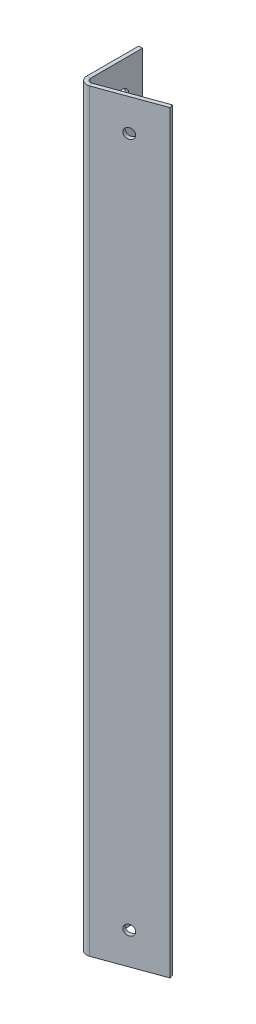
ISO-10303-21;
HEADER;
FILE_DESCRIPTION(('STEP AP214'),'2;1');
FILE_NAME('part.step','',(''),(''),'','','');
FILE_SCHEMA(('AUTOMOTIVE_DESIGN { 1 0 10303 214 1 1 1 1 }'));
ENDSEC;
DATA;
#1=APPLICATION_CONTEXT('core data for automotive mechanical design processes');
#2=APPLICATION_PROTOCOL_DEFINITION('international standard','automotive_design',2000,#1);
#3=PRODUCT_CONTEXT('',#1,'mechanical');
#4=PRODUCT('Part','Part','',(#3));
#5=PRODUCT_RELATED_PRODUCT_CATEGORY('part','',(#4));
#6=PRODUCT_DEFINITION_FORMATION('','',#4);
#7=PRODUCT_DEFINITION_CONTEXT('part definition',#1,'design');
#8=PRODUCT_DEFINITION('design','',#6,#7);
#9=PRODUCT_DEFINITION_SHAPE('','',#8);
#10=(LENGTH_UNIT() NAMED_UNIT(*) SI_UNIT(.MILLI.,.METRE.));
#11=(NAMED_UNIT(*) PLANE_ANGLE_UNIT() SI_UNIT($,.RADIAN.));
#12=(NAMED_UNIT(*) SI_UNIT($,.STERADIAN.) SOLID_ANGLE_UNIT());
#13=UNCERTAINTY_MEASURE_WITH_UNIT(LENGTH_MEASURE(1.E-05),#10,'distance_accuracy_value','');
#14=(GEOMETRIC_REPRESENTATION_CONTEXT(3) GLOBAL_UNCERTAINTY_ASSIGNED_CONTEXT((#13)) GLOBAL_UNIT_ASSIGNED_CONTEXT((#10,
#11,#12)) REPRESENTATION_CONTEXT('',''));
#15=CARTESIAN_POINT('',(0.,0.,0.));
#16=DIRECTION('',(0.,0.,1.));
#17=DIRECTION('',(1.,0.,0.));
#18=AXIS2_PLACEMENT_3D('',#15,#16,#17);
#19=CARTESIAN_POINT('',(1.97990992308686,0.,-2.86285028864506));
#20=DIRECTION('',(0.342020143325673,0.,0.939692620785907));
#21=DIRECTION('',(0.939692620785907,0.,-0.342020143325673));
#22=AXIS2_PLACEMENT_3D('',#19,#20,#21);
#23=PLANE('',#22);
#24=CARTESIAN_POINT('',(13.5381291587535,137.3,-7.06969805155084));
#25=DIRECTION('',(0.342020143325673,0.,0.939692620785907));
#26=DIRECTION('',(0.939692620785907,0.,-0.342020143325673));
#27=AXIS2_PLACEMENT_3D('',#24,#25,#26);
#28=CIRCLE('',#27,2.);
#29=CARTESIAN_POINT('',(15.4175144003253,137.3,-7.75373833820218));
#30=VERTEX_POINT('',#29);
#31=EDGE_CURVE('E577',#30,#30,#28,.T.);
#32=ORIENTED_EDGE('',*,*,#31,.T.);
#33=EDGE_LOOP('',(#32));
#34=FACE_BOUND('',#33,.T.);
#35=CARTESIAN_POINT('',(13.5381291587535,-137.3,-7.06969805155084));
#36=DIRECTION('',(0.342020143325673,0.,0.939692620785907));
#37=DIRECTION('',(0.939692620785907,0.,-0.342020143325673));
#38=AXIS2_PLACEMENT_3D('',#35,#36,#37);
#39=CIRCLE('',#38,2.);
#40=CARTESIAN_POINT('',(15.4175144003253,-137.3,-7.75373833820218));
#41=VERTEX_POINT('',#40);
#42=EDGE_CURVE('E339',#41,#41,#39,.T.);
#43=ORIENTED_EDGE('',*,*,#42,.T.);
#44=EDGE_LOOP('',(#43));
#45=FACE_BOUND('',#44,.T.);
#46=DIRECTION('',(-0.939692620785907,0.,0.342020143325673));
#47=VECTOR('',#46,1.);
#48=CARTESIAN_POINT('',(-21.5124055965608,-150.,5.68765329449675));
#49=LINE('',#48,#47);
#50=CARTESIAN_POINT('',(25.4722254427345,-150.,-11.4133538717869));
#51=VERTEX_POINT('',#50);
#52=CARTESIAN_POINT('',(2.01303021498851,-150.,-2.87490508904747));
#53=VERTEX_POINT('',#52);
#54=EDGE_CURVE('E168',#51,#53,#49,.T.);
#55=ORIENTED_EDGE('',*,*,#54,.T.);
#56=DIRECTION('',(0.,1.,0.));
#57=VECTOR('',#56,1.);
#58=CARTESIAN_POINT('',(2.01303021498851,0.,-2.87490508904747));
#59=LINE('',#58,#57);
#60=CARTESIAN_POINT('',(2.01303021498851,150.,-2.87490508904747));
#61=VERTEX_POINT('',#60);
#62=EDGE_CURVE('E159',#53,#61,#59,.T.);
#63=ORIENTED_EDGE('',*,*,#62,.T.);
#64=DIRECTION('',(0.939692620785907,0.,-0.342020143325673));
#65=VECTOR('',#64,1.);
#66=CARTESIAN_POINT('',(-21.5124055965608,150.,5.68765329449675));
#67=LINE('',#66,#65);
#68=CARTESIAN_POINT('',(25.4722254427345,150.,-11.4133538717869));
#69=VERTEX_POINT('',#68);
#70=EDGE_CURVE('E172',#61,#69,#67,.T.);
#71=ORIENTED_EDGE('',*,*,#70,.T.);
#72=DIRECTION('',(0.,-1.,0.));
#73=VECTOR('',#72,1.);
#74=CARTESIAN_POINT('',(25.4722254427345,-150.,-11.4133538717869));
#75=LINE('',#74,#73);
#76=EDGE_CURVE('E290',#69,#51,#75,.T.);
#77=ORIENTED_EDGE('',*,*,#76,.T.);
#78=EDGE_LOOP('',(#55,#63,#71,#77));
#79=FACE_BOUND('',#78,.T.);
#80=ADVANCED_FACE('F149',(#34,#45,#79),#23,.F.);
#81=CARTESIAN_POINT('',(-20.9993753815723,150.,7.09719222567561));
#82=DIRECTION('',(0.,1.,0.));
#83=DIRECTION('',(0.939692620785907,0.,-0.342020143325673));
#84=AXIS2_PLACEMENT_3D('',#81,#82,#83);
#85=PLANE('',#84);
#86=DIRECTION('',(-0.342020143325673,0.,-0.939692620785907));
#87=VECTOR('',#86,1.);
#88=CARTESIAN_POINT('',(2.52606042997702,150.,-1.46536615786861));
#89=LINE('',#88,#87);
#90=CARTESIAN_POINT('',(2.52606042997702,150.,-1.46536615786861));
#91=VERTEX_POINT('',#90);
#92=EDGE_CURVE('E305',#91,#61,#89,.T.);
#93=ORIENTED_EDGE('',*,*,#92,.F.);
#94=DIRECTION('',(0.939692620785907,0.,-0.342020143325673));
#95=VECTOR('',#94,1.);
#96=CARTESIAN_POINT('',(-20.9993753815723,150.,7.09719222567561));
#97=LINE('',#96,#95);
#98=CARTESIAN_POINT('',(25.985255657723,150.,-10.003814940608));
#99=VERTEX_POINT('',#98);
#100=EDGE_CURVE('E155',#91,#99,#97,.T.);
#101=ORIENTED_EDGE('',*,*,#100,.T.);
#102=DIRECTION('',(-0.342020143325673,0.,-0.939692620785907));
#103=VECTOR('',#102,1.);
#104=CARTESIAN_POINT('',(25.985255657723,150.,-10.003814940608));
#105=LINE('',#104,#103);
#106=EDGE_CURVE('E300',#99,#69,#105,.T.);
#107=ORIENTED_EDGE('',*,*,#106,.T.);
#108=ORIENTED_EDGE('',*,*,#70,.F.);
#109=EDGE_LOOP('',(#93,#101,#107,#108));
#110=FACE_BOUND('',#109,.T.);
#111=ADVANCED_FACE('F319',(#110),#85,.T.);
#112=CARTESIAN_POINT('',(-20.9993753815723,-150.,7.09719222567561));
#113=DIRECTION('',(0.,-1.,0.));
#114=DIRECTION('',(-0.939692620785907,0.,0.342020143325673));
#115=AXIS2_PLACEMENT_3D('',#112,#113,#114);
#116=PLANE('',#115);
#117=DIRECTION('',(0.342020143325673,0.,0.939692620785907));
#118=VECTOR('',#117,1.);
#119=CARTESIAN_POINT('',(2.52606042997702,-150.,-1.46536615786861));
#120=LINE('',#119,#118);
#121=CARTESIAN_POINT('',(2.52606042997702,-150.,-1.46536615786861));
#122=VERTEX_POINT('',#121);
#123=EDGE_CURVE('E12',#53,#122,#120,.T.);
#124=ORIENTED_EDGE('',*,*,#123,.F.);
#125=ORIENTED_EDGE('',*,*,#54,.F.);
#126=DIRECTION('',(-0.342020143325673,0.,-0.939692620785907));
#127=VECTOR('',#126,1.);
#128=CARTESIAN_POINT('',(25.985255657723,-150.,-10.003814940608));
#129=LINE('',#128,#127);
#130=CARTESIAN_POINT('',(25.985255657723,-150.,-10.003814940608));
#131=VERTEX_POINT('',#130);
#132=EDGE_CURVE('E291',#131,#51,#129,.T.);
#133=ORIENTED_EDGE('',*,*,#132,.F.);
#134=DIRECTION('',(-0.939692620785907,0.,0.342020143325673));
#135=VECTOR('',#134,1.);
#136=CARTESIAN_POINT('',(-20.9993753815723,-150.,7.09719222567561));
#137=LINE('',#136,#135);
#138=EDGE_CURVE('E288',#131,#122,#137,.T.);
#139=ORIENTED_EDGE('',*,*,#138,.T.);
#140=EDGE_LOOP('',(#124,#125,#133,#139));
#141=FACE_BOUND('',#140,.T.);
#142=ADVANCED_FACE('F148',(#141),#116,.T.);
#143=CARTESIAN_POINT('',(25.985255657723,-150.,-10.003814940608));
#144=DIRECTION('',(0.939692620785907,0.,-0.342020143325673));
#145=DIRECTION('',(-0.342020143325673,0.,-0.939692620785907));
#146=AXIS2_PLACEMENT_3D('',#143,#144,#145);
#147=PLANE('',#146);
#148=ORIENTED_EDGE('',*,*,#76,.F.);
#149=ORIENTED_EDGE('',*,*,#106,.F.);
#150=DIRECTION('',(0.,-1.,0.));
#151=VECTOR('',#150,1.);
#152=CARTESIAN_POINT('',(25.985255657723,-150.,-10.003814940608));
#153=LINE('',#152,#151);
#154=EDGE_CURVE('E284',#99,#131,#153,.T.);
#155=ORIENTED_EDGE('',*,*,#154,.T.);
#156=ORIENTED_EDGE('',*,*,#132,.T.);
#157=EDGE_LOOP('',(#148,#149,#155,#156));
#158=FACE_BOUND('',#157,.T.);
#159=ADVANCED_FACE('F324',(#158),#147,.T.);
#160=CARTESIAN_POINT('',(2.49294013807537,0.,-1.4533113574662));
#161=DIRECTION('',(0.342020143325673,0.,0.939692620785907));
#162=DIRECTION('',(0.939692620785907,0.,-0.342020143325673));
#163=AXIS2_PLACEMENT_3D('',#160,#161,#162);
#164=PLANE('',#163);
#165=CARTESIAN_POINT('',(14.051159373742,137.3,-5.66015912037198));
#166=DIRECTION('',(0.342020143325673,0.,0.939692620785907));
#167=DIRECTION('',(0.939692620785907,0.,-0.342020143325673));
#168=AXIS2_PLACEMENT_3D('',#165,#166,#167);
#169=CIRCLE('',#168,2.);
#170=CARTESIAN_POINT('',(15.9305446153138,137.3,-6.34419940702332));
#171=VERTEX_POINT('',#170);
#172=EDGE_CURVE('E575',#171,#171,#169,.T.);
#173=ORIENTED_EDGE('',*,*,#172,.F.);
#174=EDGE_LOOP('',(#173));
#175=FACE_BOUND('',#174,.T.);
#176=CARTESIAN_POINT('',(14.051159373742,-137.3,-5.66015912037198));
#177=DIRECTION('',(0.342020143325673,0.,0.939692620785907));
#178=DIRECTION('',(0.939692620785907,0.,-0.342020143325673));
#179=AXIS2_PLACEMENT_3D('',#176,#177,#178);
#180=CIRCLE('',#179,2.);
#181=CARTESIAN_POINT('',(15.9305446153138,-137.3,-6.34419940702332));
#182=VERTEX_POINT('',#181);
#183=EDGE_CURVE('E576',#182,#182,#180,.T.);
#184=ORIENTED_EDGE('',*,*,#183,.F.);
#185=EDGE_LOOP('',(#184));
#186=FACE_BOUND('',#185,.T.);
#187=DIRECTION('',(0.,1.,0.));
#188=VECTOR('',#187,1.);
#189=CARTESIAN_POINT('',(2.52606042997702,0.,-1.46536615786861));
#190=LINE('',#189,#188);
#191=EDGE_CURVE('E298',#122,#91,#190,.T.);
#192=ORIENTED_EDGE('',*,*,#191,.F.);
#193=ORIENTED_EDGE('',*,*,#138,.F.);
#194=ORIENTED_EDGE('',*,*,#154,.F.);
#195=ORIENTED_EDGE('',*,*,#100,.F.);
#196=EDGE_LOOP('',(#192,#193,#194,#195));
#197=FACE_BOUND('',#196,.T.);
#198=ADVANCED_FACE('F323',(#175,#186,#197),#164,.T.);
#199=CARTESIAN_POINT('',(-1.5,-150.,-25.));
#200=DIRECTION('',(0.,0.,-1.));
#201=DIRECTION('',(-1.,0.,0.));
#202=AXIS2_PLACEMENT_3D('',#199,#200,#201);
#203=PLANE('',#202);
#204=DIRECTION('',(0.,1.,0.));
#205=VECTOR('',#204,1.);
#206=CARTESIAN_POINT('',(0.,-150.,-25.));
#207=LINE('',#206,#205);
#208=CARTESIAN_POINT('',(0.,-150.,-25.));
#209=VERTEX_POINT('',#208);
#210=CARTESIAN_POINT('',(0.,150.,-25.));
#211=VERTEX_POINT('',#210);
#212=EDGE_CURVE('E264',#209,#211,#207,.T.);
#213=ORIENTED_EDGE('',*,*,#212,.F.);
#214=DIRECTION('',(1.,0.,0.));
#215=VECTOR('',#214,1.);
#216=CARTESIAN_POINT('',(-1.5,-150.,-25.));
#217=LINE('',#216,#215);
#218=CARTESIAN_POINT('',(-1.5,-150.,-25.));
#219=VERTEX_POINT('',#218);
#220=EDGE_CURVE('E252',#219,#209,#217,.T.);
#221=ORIENTED_EDGE('',*,*,#220,.F.);
#222=DIRECTION('',(0.,1.,0.));
#223=VECTOR('',#222,1.);
#224=CARTESIAN_POINT('',(-1.5,-150.,-25.));
#225=LINE('',#224,#223);
#226=CARTESIAN_POINT('',(-1.5,150.,-25.));
#227=VERTEX_POINT('',#226);
#228=EDGE_CURVE('E246',#219,#227,#225,.T.);
#229=ORIENTED_EDGE('',*,*,#228,.T.);
#230=DIRECTION('',(1.,0.,0.));
#231=VECTOR('',#230,1.);
#232=CARTESIAN_POINT('',(-1.5,150.,-25.));
#233=LINE('',#232,#231);
#234=EDGE_CURVE('E239',#227,#211,#233,.T.);
#235=ORIENTED_EDGE('',*,*,#234,.T.);
#236=EDGE_LOOP('',(#213,#221,#229,#235));
#237=FACE_BOUND('',#236,.T.);
#238=ADVANCED_FACE('F346',(#237),#203,.T.);
#239=CARTESIAN_POINT('',(-1.5,0.,0.));
#240=DIRECTION('',(-1.,0.,0.));
#241=DIRECTION('',(0.,0.,1.));
#242=AXIS2_PLACEMENT_3D('',#239,#240,#241);
#243=PLANE('',#242);
#244=CARTESIAN_POINT('',(-1.5,137.3,-16.9844440202263));
#245=DIRECTION('',(-1.,0.,0.));
#246=DIRECTION('',(0.,0.,1.));
#247=AXIS2_PLACEMENT_3D('',#244,#245,#246);
#248=CIRCLE('',#247,2.5);
#249=CARTESIAN_POINT('',(-1.5,137.3,-14.4844440202263));
#250=VERTEX_POINT('',#249);
#251=EDGE_CURVE('E548',#250,#250,#248,.T.);
#252=ORIENTED_EDGE('',*,*,#251,.F.);
#253=EDGE_LOOP('',(#252));
#254=FACE_BOUND('',#253,.T.);
#255=CARTESIAN_POINT('',(-1.5,-137.3,-16.9844440202263));
#256=DIRECTION('',(-1.,0.,0.));
#257=DIRECTION('',(0.,0.,1.));
#258=AXIS2_PLACEMENT_3D('',#255,#256,#257);
#259=CIRCLE('',#258,2.5);
#260=CARTESIAN_POINT('',(-1.5,-137.3,-14.4844440202263));
#261=VERTEX_POINT('',#260);
#262=EDGE_CURVE('E555',#261,#261,#259,.T.);
#263=ORIENTED_EDGE('',*,*,#262,.F.);
#264=EDGE_LOOP('',(#263));
#265=FACE_BOUND('',#264,.T.);
#266=CARTESIAN_POINT('',(-1.5,0.,-16.9844440202263));
#267=DIRECTION('',(-1.,0.,0.));
#268=DIRECTION('',(0.,0.,1.));
#269=AXIS2_PLACEMENT_3D('',#266,#267,#268);
#270=CIRCLE('',#269,2.5);
#271=CARTESIAN_POINT('',(-1.5,0.,-14.4844440202263));
#272=VERTEX_POINT('',#271);
#273=EDGE_CURVE('E562',#272,#272,#270,.T.);
#274=ORIENTED_EDGE('',*,*,#273,.F.);
#275=EDGE_LOOP('',(#274));
#276=FACE_BOUND('',#275,.T.);
#277=DIRECTION('',(0.,0.,-1.));
#278=VECTOR('',#277,1.);
#279=CARTESIAN_POINT('',(-1.5,-150.,-25.));
#280=LINE('',#279,#278);
#281=CARTESIAN_POINT('',(-1.5,-150.,-4.28444402022633));
#282=VERTEX_POINT('',#281);
#283=EDGE_CURVE('E243',#282,#219,#280,.T.);
#284=ORIENTED_EDGE('',*,*,#283,.F.);
#285=DIRECTION('',(0.,1.,0.));
#286=VECTOR('',#285,1.);
#287=CARTESIAN_POINT('',(-1.5,0.,-4.28444402022633));
#288=LINE('',#287,#286);
#289=CARTESIAN_POINT('',(-1.5,150.,-4.28444402022633));
#290=VERTEX_POINT('',#289);
#291=EDGE_CURVE('E233',#282,#290,#288,.T.);
#292=ORIENTED_EDGE('',*,*,#291,.T.);
#293=DIRECTION('',(0.,0.,1.));
#294=VECTOR('',#293,1.);
#295=CARTESIAN_POINT('',(-1.5,150.,-25.));
#296=LINE('',#295,#294);
#297=EDGE_CURVE('E237',#227,#290,#296,.T.);
#298=ORIENTED_EDGE('',*,*,#297,.F.);
#299=ORIENTED_EDGE('',*,*,#228,.F.);
#300=EDGE_LOOP('',(#284,#292,#298,#299));
#301=FACE_BOUND('',#300,.T.);
#302=ADVANCED_FACE('F242',(#254,#265,#276,#301),#243,.T.);
#303=CARTESIAN_POINT('',(-1.5,150.,-25.));
#304=DIRECTION('',(0.,1.,0.));
#305=DIRECTION('',(0.,0.,1.));
#306=AXIS2_PLACEMENT_3D('',#303,#304,#305);
#307=PLANE('',#306);
#308=ORIENTED_EDGE('',*,*,#297,.T.);
#309=DIRECTION('',(1.,0.,0.));
#310=VECTOR('',#309,1.);
#311=CARTESIAN_POINT('',(-1.5,150.,-4.28444402022633));
#312=LINE('',#311,#310);
#313=CARTESIAN_POINT('',(0.,150.,-4.28444402022633));
#314=VERTEX_POINT('',#313);
#315=EDGE_CURVE('E275',#290,#314,#312,.T.);
#316=ORIENTED_EDGE('',*,*,#315,.T.);
#317=DIRECTION('',(0.,0.,1.));
#318=VECTOR('',#317,1.);
#319=CARTESIAN_POINT('',(0.,150.,-25.));
#320=LINE('',#319,#318);
#321=EDGE_CURVE('E259',#211,#314,#320,.T.);
#322=ORIENTED_EDGE('',*,*,#321,.F.);
#323=ORIENTED_EDGE('',*,*,#234,.F.);
#324=EDGE_LOOP('',(#308,#316,#322,#323));
#325=FACE_BOUND('',#324,.T.);
#326=ADVANCED_FACE('F351',(#325),#307,.T.);
#327=CARTESIAN_POINT('',(0.,0.,0.));
#328=DIRECTION('',(-1.,0.,0.));
#329=DIRECTION('',(0.,0.,1.));
#330=AXIS2_PLACEMENT_3D('',#327,#328,#329);
#331=PLANE('',#330);
#332=CARTESIAN_POINT('',(0.,137.3,-16.9844440202263));
#333=DIRECTION('',(-1.,0.,0.));
#334=DIRECTION('',(0.,0.,1.));
#335=AXIS2_PLACEMENT_3D('',#332,#333,#334);
#336=CIRCLE('',#335,2.5);
#337=CARTESIAN_POINT('',(0.,137.3,-14.4844440202263));
#338=VERTEX_POINT('',#337);
#339=EDGE_CURVE('E546',#338,#338,#336,.T.);
#340=ORIENTED_EDGE('',*,*,#339,.T.);
#341=EDGE_LOOP('',(#340));
#342=FACE_BOUND('',#341,.T.);
#343=CARTESIAN_POINT('',(0.,-137.3,-16.9844440202263));
#344=DIRECTION('',(-1.,0.,0.));
#345=DIRECTION('',(0.,0.,1.));
#346=AXIS2_PLACEMENT_3D('',#343,#344,#345);
#347=CIRCLE('',#346,2.5);
#348=CARTESIAN_POINT('',(0.,-137.3,-14.4844440202263));
#349=VERTEX_POINT('',#348);
#350=EDGE_CURVE('E557',#349,#349,#347,.T.);
#351=ORIENTED_EDGE('',*,*,#350,.T.);
#352=EDGE_LOOP('',(#351));
#353=FACE_BOUND('',#352,.T.);
#354=CARTESIAN_POINT('',(0.,0.,-16.9844440202263));
#355=DIRECTION('',(-1.,0.,0.));
#356=DIRECTION('',(0.,0.,1.));
#357=AXIS2_PLACEMENT_3D('',#354,#355,#356);
#358=CIRCLE('',#357,2.5);
#359=CARTESIAN_POINT('',(0.,0.,-14.4844440202263));
#360=VERTEX_POINT('',#359);
#361=EDGE_CURVE('E568',#360,#360,#358,.T.);
#362=ORIENTED_EDGE('',*,*,#361,.T.);
#363=EDGE_LOOP('',(#362));
#364=FACE_BOUND('',#363,.T.);
#365=DIRECTION('',(0.,1.,0.));
#366=VECTOR('',#365,1.);
#367=CARTESIAN_POINT('',(0.,0.,-4.28444402022633));
#368=LINE('',#367,#366);
#369=CARTESIAN_POINT('',(0.,-150.,-4.28444402022633));
#370=VERTEX_POINT('',#369);
#371=EDGE_CURVE('E285',#370,#314,#368,.T.);
#372=ORIENTED_EDGE('',*,*,#371,.F.);
#373=DIRECTION('',(0.,0.,-1.));
#374=VECTOR('',#373,1.);
#375=CARTESIAN_POINT('',(0.,-150.,-25.));
#376=LINE('',#375,#374);
#377=EDGE_CURVE('E253',#370,#209,#376,.T.);
#378=ORIENTED_EDGE('',*,*,#377,.T.);
#379=ORIENTED_EDGE('',*,*,#212,.T.);
#380=ORIENTED_EDGE('',*,*,#321,.T.);
#381=EDGE_LOOP('',(#372,#378,#379,#380));
#382=FACE_BOUND('',#381,.T.);
#383=ADVANCED_FACE('F347',(#342,#353,#364,#382),#331,.F.);
#384=CARTESIAN_POINT('',(-1.5,-150.,-25.));
#385=DIRECTION('',(0.,-1.,0.));
#386=DIRECTION('',(0.,0.,-1.));
#387=AXIS2_PLACEMENT_3D('',#384,#385,#386);
#388=PLANE('',#387);
#389=ORIENTED_EDGE('',*,*,#377,.F.);
#390=DIRECTION('',(-1.,0.,0.));
#391=VECTOR('',#390,1.);
#392=CARTESIAN_POINT('',(-1.5,-150.,-4.28444402022633));
#393=LINE('',#392,#391);
#394=EDGE_CURVE('E221',#370,#282,#393,.T.);
#395=ORIENTED_EDGE('',*,*,#394,.T.);
#396=ORIENTED_EDGE('',*,*,#283,.T.);
#397=ORIENTED_EDGE('',*,*,#220,.T.);
#398=EDGE_LOOP('',(#389,#395,#396,#397));
#399=FACE_BOUND('',#398,.T.);
#400=ADVANCED_FACE('F251',(#399),#388,.T.);
#401=CARTESIAN_POINT('',(1.5,-150.,-4.28444402022633));
#402=DIRECTION('',(0.,-1.,0.));
#403=DIRECTION('',(0.,0.,-1.));
#404=AXIS2_PLACEMENT_3D('',#401,#402,#403);
#405=PLANE('',#404);
#406=ORIENTED_EDGE('',*,*,#394,.F.);
#407=CARTESIAN_POINT('',(1.5,-150.,-4.28444402022633));
#408=DIRECTION('',(0.,1.,0.));
#409=DIRECTION('',(0.,0.,1.));
#410=AXIS2_PLACEMENT_3D('',#407,#408,#409);
#411=CIRCLE('',#410,1.5);
#412=EDGE_CURVE('E335',#370,#53,#411,.T.);
#413=ORIENTED_EDGE('',*,*,#412,.T.);
#414=ORIENTED_EDGE('',*,*,#123,.T.);
#415=CARTESIAN_POINT('',(1.5,-150.,-4.28444402022633));
#416=DIRECTION('',(0.,1.,0.));
#417=DIRECTION('',(0.,0.,-1.));
#418=AXIS2_PLACEMENT_3D('',#415,#416,#417);
#419=CIRCLE('',#418,3.);
#420=EDGE_CURVE('E216',#282,#122,#419,.T.);
#421=ORIENTED_EDGE('',*,*,#420,.F.);
#422=EDGE_LOOP('',(#406,#413,#414,#421));
#423=FACE_BOUND('',#422,.T.);
#424=ADVANCED_FACE('F218',(#423),#405,.T.);
#425=CARTESIAN_POINT('',(1.5,150.,-4.28444402022633));
#426=DIRECTION('',(0.,1.,0.));
#427=DIRECTION('',(0.,0.,1.));
#428=AXIS2_PLACEMENT_3D('',#425,#426,#427);
#429=PLANE('',#428);
#430=ORIENTED_EDGE('',*,*,#92,.T.);
#431=CARTESIAN_POINT('',(1.5,150.,-4.28444402022633));
#432=DIRECTION('',(0.,1.,0.));
#433=DIRECTION('',(0.,0.,1.));
#434=AXIS2_PLACEMENT_3D('',#431,#432,#433);
#435=CIRCLE('',#434,1.5);
#436=EDGE_CURVE('E227',#61,#314,#435,.F.);
#437=ORIENTED_EDGE('',*,*,#436,.T.);
#438=ORIENTED_EDGE('',*,*,#315,.F.);
#439=CARTESIAN_POINT('',(1.5,150.,-4.28444402022633));
#440=DIRECTION('',(0.,-1.,0.));
#441=DIRECTION('',(0.,0.,1.));
#442=AXIS2_PLACEMENT_3D('',#439,#440,#441);
#443=CIRCLE('',#442,3.);
#444=EDGE_CURVE('E228',#91,#290,#443,.T.);
#445=ORIENTED_EDGE('',*,*,#444,.F.);
#446=EDGE_LOOP('',(#430,#437,#438,#445));
#447=FACE_BOUND('',#446,.T.);
#448=ADVANCED_FACE('F332',(#447),#429,.T.);
#449=CARTESIAN_POINT('',(1.5,-300.034847510786,-4.28444402022633));
#450=DIRECTION('',(0.,1.,0.));
#451=DIRECTION('',(0.,0.,1.));
#452=AXIS2_PLACEMENT_3D('',#449,#450,#451);
#453=CYLINDRICAL_SURFACE('',#452,3.);
#454=ORIENTED_EDGE('',*,*,#444,.T.);
#455=ORIENTED_EDGE('',*,*,#291,.F.);
#456=ORIENTED_EDGE('',*,*,#420,.T.);
#457=ORIENTED_EDGE('',*,*,#191,.T.);
#458=EDGE_LOOP('',(#454,#455,#456,#457));
#459=FACE_BOUND('',#458,.T.);
#460=ADVANCED_FACE('F231',(#459),#453,.T.);
#461=CARTESIAN_POINT('',(1.5,-300.034847510786,-4.28444402022633));
#462=DIRECTION('',(0.,1.,0.));
#463=DIRECTION('',(0.,0.,1.));
#464=AXIS2_PLACEMENT_3D('',#461,#462,#463);
#465=CYLINDRICAL_SURFACE('',#464,1.5);
#466=ORIENTED_EDGE('',*,*,#436,.F.);
#467=ORIENTED_EDGE('',*,*,#62,.F.);
#468=ORIENTED_EDGE('',*,*,#412,.F.);
#469=ORIENTED_EDGE('',*,*,#371,.T.);
#470=EDGE_LOOP('',(#466,#467,#468,#469));
#471=FACE_BOUND('',#470,.T.);
#472=ADVANCED_FACE('F334',(#471),#465,.F.);
#473=CARTESIAN_POINT('',(14.051159373742,-137.3,-5.66015912037198));
#474=DIRECTION('',(0.342020143325673,0.,0.939692620785907));
#475=DIRECTION('',(0.939692620785907,0.,-0.342020143325673));
#476=AXIS2_PLACEMENT_3D('',#473,#474,#475);
#477=CYLINDRICAL_SURFACE('',#476,2.);
#478=ORIENTED_EDGE('',*,*,#42,.F.);
#479=EDGE_LOOP('',(#478));
#480=FACE_BOUND('',#479,.T.);
#481=ORIENTED_EDGE('',*,*,#183,.T.);
#482=EDGE_LOOP('',(#481));
#483=FACE_BOUND('',#482,.T.);
#484=ADVANCED_FACE('F486',(#480,#483),#477,.F.);
#485=CARTESIAN_POINT('',(14.051159373742,137.3,-5.66015912037198));
#486=DIRECTION('',(0.342020143325673,0.,0.939692620785907));
#487=DIRECTION('',(0.939692620785907,0.,-0.342020143325673));
#488=AXIS2_PLACEMENT_3D('',#485,#486,#487);
#489=CYLINDRICAL_SURFACE('',#488,2.);
#490=ORIENTED_EDGE('',*,*,#31,.F.);
#491=EDGE_LOOP('',(#490));
#492=FACE_BOUND('',#491,.T.);
#493=ORIENTED_EDGE('',*,*,#172,.T.);
#494=EDGE_LOOP('',(#493));
#495=FACE_BOUND('',#494,.T.);
#496=ADVANCED_FACE('F496',(#492,#495),#489,.F.);
#497=CARTESIAN_POINT('',(-1.5,0.,-16.9844440202263));
#498=DIRECTION('',(-1.,0.,0.));
#499=DIRECTION('',(0.,0.,1.));
#500=AXIS2_PLACEMENT_3D('',#497,#498,#499);
#501=CYLINDRICAL_SURFACE('',#500,2.5);
#502=ORIENTED_EDGE('',*,*,#361,.F.);
#503=EDGE_LOOP('',(#502));
#504=FACE_BOUND('',#503,.T.);
#505=ORIENTED_EDGE('',*,*,#273,.T.);
#506=EDGE_LOOP('',(#505));
#507=FACE_BOUND('',#506,.T.);
#508=ADVANCED_FACE('F504',(#504,#507),#501,.F.);
#509=CARTESIAN_POINT('',(-1.5,-137.3,-16.9844440202263));
#510=DIRECTION('',(-1.,0.,0.));
#511=DIRECTION('',(0.,0.,1.));
#512=AXIS2_PLACEMENT_3D('',#509,#510,#511);
#513=CYLINDRICAL_SURFACE('',#512,2.5);
#514=ORIENTED_EDGE('',*,*,#350,.F.);
#515=EDGE_LOOP('',(#514));
#516=FACE_BOUND('',#515,.T.);
#517=ORIENTED_EDGE('',*,*,#262,.T.);
#518=EDGE_LOOP('',(#517));
#519=FACE_BOUND('',#518,.T.);
#520=ADVANCED_FACE('F511',(#516,#519),#513,.F.);
#521=CARTESIAN_POINT('',(-1.5,137.3,-16.9844440202263));
#522=DIRECTION('',(-1.,0.,0.));
#523=DIRECTION('',(0.,0.,1.));
#524=AXIS2_PLACEMENT_3D('',#521,#522,#523);
#525=CYLINDRICAL_SURFACE('',#524,2.5);
#526=ORIENTED_EDGE('',*,*,#339,.F.);
#527=EDGE_LOOP('',(#526));
#528=FACE_BOUND('',#527,.T.);
#529=ORIENTED_EDGE('',*,*,#251,.T.);
#530=EDGE_LOOP('',(#529));
#531=FACE_BOUND('',#530,.T.);
#532=ADVANCED_FACE('F524',(#528,#531),#525,.F.);
#533=CLOSED_SHELL('',(#80,#111,#142,#159,#198,#238,#302,#326,#383,#400,#424,#448,#460,#472,#484,
#496,#508,#520,#532));
#534=MANIFOLD_SOLID_BREP('B2',#533);
#535=ADVANCED_BREP_SHAPE_REPRESENTATION('',(#18,#534),#14);
#536=SHAPE_DEFINITION_REPRESENTATION(#9,#535);
ENDSEC;
END-ISO-10303-21;
